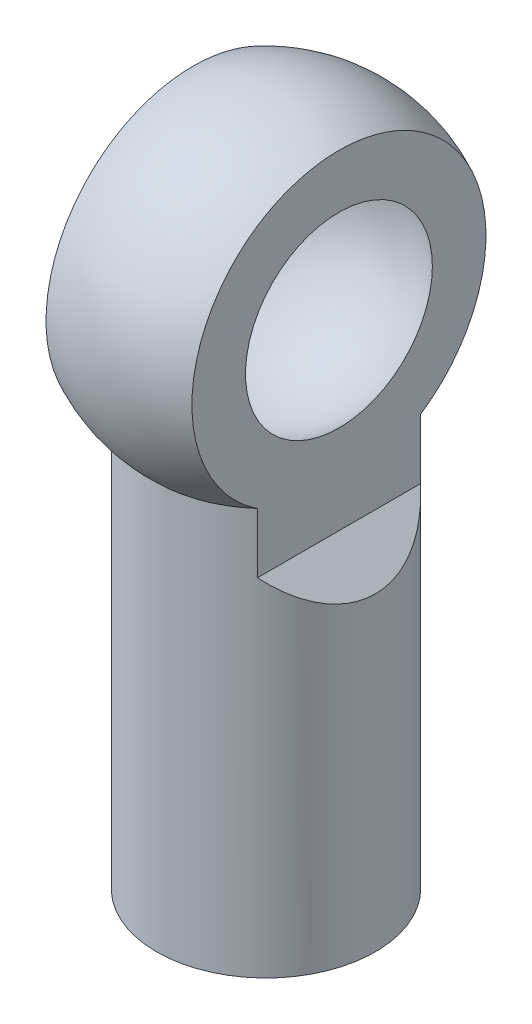
ISO-10303-21;
HEADER;
FILE_DESCRIPTION(('STEP AP214'),'2;1');
FILE_NAME('part.step','',(''),(''),'','','');
FILE_SCHEMA(('AUTOMOTIVE_DESIGN { 1 0 10303 214 1 1 1 1 }'));
ENDSEC;
DATA;
#1=APPLICATION_CONTEXT('core data for automotive mechanical design processes');
#2=APPLICATION_PROTOCOL_DEFINITION('international standard','automotive_design',2000,#1);
#3=PRODUCT_CONTEXT('',#1,'mechanical');
#4=PRODUCT('Part','Part','',(#3));
#5=PRODUCT_RELATED_PRODUCT_CATEGORY('part','',(#4));
#6=PRODUCT_DEFINITION_FORMATION('','',#4);
#7=PRODUCT_DEFINITION_CONTEXT('part definition',#1,'design');
#8=PRODUCT_DEFINITION('design','',#6,#7);
#9=PRODUCT_DEFINITION_SHAPE('','',#8);
#10=(LENGTH_UNIT() NAMED_UNIT(*) SI_UNIT(.MILLI.,.METRE.));
#11=(NAMED_UNIT(*) PLANE_ANGLE_UNIT() SI_UNIT($,.RADIAN.));
#12=(NAMED_UNIT(*) SI_UNIT($,.STERADIAN.) SOLID_ANGLE_UNIT());
#13=UNCERTAINTY_MEASURE_WITH_UNIT(LENGTH_MEASURE(1.E-05),#10,'distance_accuracy_value','');
#14=(GEOMETRIC_REPRESENTATION_CONTEXT(3) GLOBAL_UNCERTAINTY_ASSIGNED_CONTEXT((#13)) GLOBAL_UNIT_ASSIGNED_CONTEXT((#10,
#11,#12)) REPRESENTATION_CONTEXT('',''));
#15=CARTESIAN_POINT('',(0.,0.,0.));
#16=DIRECTION('',(0.,0.,1.));
#17=DIRECTION('',(1.,0.,0.));
#18=AXIS2_PLACEMENT_3D('',#15,#16,#17);
#19=CARTESIAN_POINT('',(0.,11.5,0.));
#20=DIRECTION('',(0.,-1.,0.));
#21=DIRECTION('',(0.,0.,-1.));
#22=AXIS2_PLACEMENT_3D('',#19,#20,#21);
#23=CYLINDRICAL_SURFACE('',#22,3.);
#24=CARTESIAN_POINT('',(0.,0.,0.));
#25=DIRECTION('',(0.,1.,0.));
#26=DIRECTION('',(0.,0.,1.));
#27=AXIS2_PLACEMENT_3D('',#24,#25,#26);
#28=CIRCLE('',#27,3.);
#29=CARTESIAN_POINT('',(0.,0.,3.));
#30=VERTEX_POINT('',#29);
#31=EDGE_CURVE('E121',#30,#30,#28,.T.);
#32=ORIENTED_EDGE('',*,*,#31,.T.);
#33=EDGE_LOOP('',(#32));
#34=FACE_BOUND('',#33,.T.);
#35=DIRECTION('',(0.,-1.,0.));
#36=VECTOR('',#35,1.);
#37=CARTESIAN_POINT('',(-2.,11.5,2.23606797749979));
#38=LINE('',#37,#36);
#39=CARTESIAN_POINT('',(-2.,11.1458980337503,2.23606797749979));
#40=VERTEX_POINT('',#39);
#41=CARTESIAN_POINT('',(-2.,9.5,2.23606797749979));
#42=VERTEX_POINT('',#41);
#43=EDGE_CURVE('E97',#40,#42,#38,.T.);
#44=ORIENTED_EDGE('',*,*,#43,.T.);
#45=CARTESIAN_POINT('',(0.,11.5,0.));
#46=DIRECTION('',(0.707106781186548,-0.707106781186547,0.));
#47=DIRECTION('',(-0.707106781186547,-0.707106781186548,0.));
#48=AXIS2_PLACEMENT_3D('',#45,#46,#47);
#49=ELLIPSE('',#48,4.24264068711929,3.);
#50=CARTESIAN_POINT('',(-2.,9.5,-2.23606797749979));
#51=VERTEX_POINT('',#50);
#52=EDGE_CURVE('E90',#42,#51,#49,.T.);
#53=ORIENTED_EDGE('',*,*,#52,.T.);
#54=DIRECTION('',(0.,-1.,0.));
#55=VECTOR('',#54,1.);
#56=CARTESIAN_POINT('',(-2.,11.5,-2.23606797749979));
#57=LINE('',#56,#55);
#58=CARTESIAN_POINT('',(-2.,11.1458980337503,-2.23606797749979));
#59=VERTEX_POINT('',#58);
#60=EDGE_CURVE('E95',#51,#59,#57,.F.);
#61=ORIENTED_EDGE('',*,*,#60,.T.);
#62=CARTESIAN_POINT('',(0.,11.1458980337503,0.));
#63=DIRECTION('',(0.,1.,0.));
#64=DIRECTION('',(0.,0.,1.));
#65=AXIS2_PLACEMENT_3D('',#62,#63,#64);
#66=CIRCLE('',#65,3.);
#67=CARTESIAN_POINT('',(2.,11.1458980337503,-2.23606797749979));
#68=VERTEX_POINT('',#67);
#69=EDGE_CURVE('E11',#68,#59,#66,.T.);
#70=ORIENTED_EDGE('',*,*,#69,.F.);
#71=DIRECTION('',(0.,-1.,0.));
#72=VECTOR('',#71,1.);
#73=CARTESIAN_POINT('',(2.,11.5,-2.23606797749979));
#74=LINE('',#73,#72);
#75=CARTESIAN_POINT('',(2.,9.5,-2.23606797749979));
#76=VERTEX_POINT('',#75);
#77=EDGE_CURVE('E109',#76,#68,#74,.F.);
#78=ORIENTED_EDGE('',*,*,#77,.F.);
#79=CARTESIAN_POINT('',(0.,11.5,0.));
#80=DIRECTION('',(0.707106781186547,0.707106781186548,0.));
#81=DIRECTION('',(0.707106781186548,-0.707106781186547,0.));
#82=AXIS2_PLACEMENT_3D('',#79,#80,#81);
#83=ELLIPSE('',#82,4.24264068711928,3.);
#84=CARTESIAN_POINT('',(2.,9.5,2.23606797749979));
#85=VERTEX_POINT('',#84);
#86=EDGE_CURVE('E68',#85,#76,#83,.T.);
#87=ORIENTED_EDGE('',*,*,#86,.F.);
#88=DIRECTION('',(0.,-1.,0.));
#89=VECTOR('',#88,1.);
#90=CARTESIAN_POINT('',(2.,11.5,2.23606797749979));
#91=LINE('',#90,#89);
#92=CARTESIAN_POINT('',(2.,11.1458980337503,2.23606797749979));
#93=VERTEX_POINT('',#92);
#94=EDGE_CURVE('E114',#93,#85,#91,.T.);
#95=ORIENTED_EDGE('',*,*,#94,.F.);
#96=EDGE_CURVE('E53',#40,#93,#66,.T.);
#97=ORIENTED_EDGE('',*,*,#96,.F.);
#98=EDGE_LOOP('',(#44,#53,#61,#70,#78,#87,#95,#97));
#99=FACE_BOUND('',#98,.T.);
#100=ADVANCED_FACE('F45',(#34,#99),#23,.T.);
#101=CARTESIAN_POINT('',(0.,14.5,0.));
#102=DIRECTION('',(0.,1.,0.));
#103=DIRECTION('',(-1.,0.,0.));
#104=AXIS2_PLACEMENT_3D('',#101,#102,#103);
#105=SPHERICAL_SURFACE('',#104,4.5);
#106=ORIENTED_EDGE('',*,*,#69,.T.);
#107=CARTESIAN_POINT('',(-2.,14.5,0.));
#108=DIRECTION('',(1.,0.,0.));
#109=DIRECTION('',(0.,0.,-1.));
#110=AXIS2_PLACEMENT_3D('',#107,#108,#109);
#111=CIRCLE('',#110,4.03112887414927);
#112=EDGE_CURVE('E61',#59,#40,#111,.T.);
#113=ORIENTED_EDGE('',*,*,#112,.T.);
#114=ORIENTED_EDGE('',*,*,#96,.T.);
#115=CARTESIAN_POINT('',(2.,14.5,0.));
#116=DIRECTION('',(1.,0.,0.));
#117=DIRECTION('',(0.,0.,-1.));
#118=AXIS2_PLACEMENT_3D('',#115,#116,#117);
#119=CIRCLE('',#118,4.03112887414927);
#120=EDGE_CURVE('E111',#68,#93,#119,.T.);
#121=ORIENTED_EDGE('',*,*,#120,.F.);
#122=EDGE_LOOP('',(#106,#113,#114,#121));
#123=FACE_BOUND('',#122,.T.);
#124=ADVANCED_FACE('F139',(#123),#105,.T.);
#125=CARTESIAN_POINT('',(0.,11.5,0.));
#126=DIRECTION('',(0.,-1.,0.));
#127=DIRECTION('',(0.,0.,-1.));
#128=AXIS2_PLACEMENT_3D('',#125,#126,#127);
#129=CYLINDRICAL_SURFACE('',#128,1.5);
#130=CARTESIAN_POINT('',(0.,0.,0.));
#131=DIRECTION('',(0.,1.,0.));
#132=DIRECTION('',(0.,0.,1.));
#133=AXIS2_PLACEMENT_3D('',#130,#131,#132);
#134=CIRCLE('',#133,1.5);
#135=CARTESIAN_POINT('',(0.,0.,1.5));
#136=VERTEX_POINT('',#135);
#137=EDGE_CURVE('E118',#136,#136,#134,.T.);
#138=ORIENTED_EDGE('',*,*,#137,.F.);
#139=EDGE_LOOP('',(#138));
#140=FACE_BOUND('',#139,.T.);
#141=CARTESIAN_POINT('',(0.,10.2573593128807,0.));
#142=DIRECTION('',(0.,1.,0.));
#143=DIRECTION('',(0.,0.,1.));
#144=AXIS2_PLACEMENT_3D('',#141,#142,#143);
#145=CIRCLE('',#144,1.5);
#146=CARTESIAN_POINT('',(0.,10.2573593128807,1.5));
#147=VERTEX_POINT('',#146);
#148=EDGE_CURVE('E116',#147,#147,#145,.T.);
#149=ORIENTED_EDGE('',*,*,#148,.T.);
#150=EDGE_LOOP('',(#149));
#151=FACE_BOUND('',#150,.T.);
#152=ADVANCED_FACE('F141',(#140,#151),#129,.F.);
#153=CARTESIAN_POINT('',(0.,0.,0.));
#154=DIRECTION('',(0.,1.,0.));
#155=DIRECTION('',(0.,0.,1.));
#156=AXIS2_PLACEMENT_3D('',#153,#154,#155);
#157=PLANE('',#156);
#158=ORIENTED_EDGE('',*,*,#31,.F.);
#159=EDGE_LOOP('',(#158));
#160=FACE_BOUND('',#159,.T.);
#161=ORIENTED_EDGE('',*,*,#137,.T.);
#162=EDGE_LOOP('',(#161));
#163=FACE_BOUND('',#162,.T.);
#164=ADVANCED_FACE('F148',(#160,#163),#157,.F.);
#165=ORIENTED_EDGE('',*,*,#148,.F.);
#166=EDGE_LOOP('',(#165));
#167=FACE_BOUND('',#166,.T.);
#168=ADVANCED_FACE('F133',(#167),#105,.T.);
#169=CARTESIAN_POINT('',(2.,0.,0.));
#170=DIRECTION('',(1.,0.,0.));
#171=DIRECTION('',(0.,0.,-1.));
#172=AXIS2_PLACEMENT_3D('',#169,#170,#171);
#173=PLANE('',#172);
#174=CARTESIAN_POINT('',(2.,14.5,0.));
#175=DIRECTION('',(1.,0.,0.));
#176=DIRECTION('',(0.,0.,-1.));
#177=AXIS2_PLACEMENT_3D('',#174,#175,#176);
#178=CIRCLE('',#177,2.5617376914899);
#179=CARTESIAN_POINT('',(2.,14.5,-2.5617376914899));
#180=VERTEX_POINT('',#179);
#181=EDGE_CURVE('E108',#180,#180,#178,.T.);
#182=ORIENTED_EDGE('',*,*,#181,.F.);
#183=EDGE_LOOP('',(#182));
#184=FACE_BOUND('',#183,.T.);
#185=ORIENTED_EDGE('',*,*,#94,.T.);
#186=DIRECTION('',(0.,0.,-1.));
#187=VECTOR('',#186,1.);
#188=CARTESIAN_POINT('',(2.,9.5,4.5));
#189=LINE('',#188,#187);
#190=EDGE_CURVE('E106',#85,#76,#189,.T.);
#191=ORIENTED_EDGE('',*,*,#190,.T.);
#192=ORIENTED_EDGE('',*,*,#77,.T.);
#193=ORIENTED_EDGE('',*,*,#120,.T.);
#194=EDGE_LOOP('',(#185,#191,#192,#193));
#195=FACE_BOUND('',#194,.T.);
#196=ADVANCED_FACE('F130',(#184,#195),#173,.T.);
#197=CARTESIAN_POINT('',(0.,14.5,0.));
#198=DIRECTION('',(0.,1.,0.));
#199=DIRECTION('',(-1.,0.,0.));
#200=AXIS2_PLACEMENT_3D('',#197,#198,#199);
#201=SPHERICAL_SURFACE('',#200,3.25);
#202=CARTESIAN_POINT('',(0.,14.5,0.));
#203=DIRECTION('',(1.,0.,0.));
#204=DIRECTION('',(0.,0.,-1.));
#205=AXIS2_PLACEMENT_3D('',#202,#203,#204);
#206=SPHERICAL_SURFACE('',#205,3.25);
#207=CARTESIAN_POINT('',(-2.,14.5,0.));
#208=DIRECTION('',(1.,0.,0.));
#209=DIRECTION('',(0.,0.,-1.));
#210=AXIS2_PLACEMENT_3D('',#207,#208,#209);
#211=CIRCLE('',#210,2.5617376914899);
#212=CARTESIAN_POINT('',(-2.,14.5,-2.5617376914899));
#213=VERTEX_POINT('',#212);
#214=EDGE_CURVE('E48',#213,#213,#211,.T.);
#215=ORIENTED_EDGE('',*,*,#214,.F.);
#216=EDGE_LOOP('',(#215));
#217=FACE_BOUND('',#216,.T.);
#218=ORIENTED_EDGE('',*,*,#181,.T.);
#219=EDGE_LOOP('',(#218));
#220=FACE_BOUND('',#219,.T.);
#221=ADVANCED_FACE('F128',(#217,#220),#206,.F.);
#222=CARTESIAN_POINT('',(-2.,0.,0.));
#223=DIRECTION('',(1.,0.,0.));
#224=DIRECTION('',(0.,0.,-1.));
#225=AXIS2_PLACEMENT_3D('',#222,#223,#224);
#226=PLANE('',#225);
#227=ORIENTED_EDGE('',*,*,#214,.T.);
#228=EDGE_LOOP('',(#227));
#229=FACE_BOUND('',#228,.T.);
#230=ORIENTED_EDGE('',*,*,#112,.F.);
#231=ORIENTED_EDGE('',*,*,#60,.F.);
#232=DIRECTION('',(0.,0.,-1.));
#233=VECTOR('',#232,1.);
#234=CARTESIAN_POINT('',(-2.,9.5,4.5));
#235=LINE('',#234,#233);
#236=EDGE_CURVE('E87',#42,#51,#235,.T.);
#237=ORIENTED_EDGE('',*,*,#236,.F.);
#238=ORIENTED_EDGE('',*,*,#43,.F.);
#239=EDGE_LOOP('',(#230,#231,#237,#238));
#240=FACE_BOUND('',#239,.T.);
#241=ADVANCED_FACE('F99',(#229,#240),#226,.F.);
#242=CARTESIAN_POINT('',(5.75,5.75,0.));
#243=DIRECTION('',(0.707106781186547,0.707106781186548,0.));
#244=DIRECTION('',(-0.707106781186548,0.707106781186547,0.));
#245=AXIS2_PLACEMENT_3D('',#242,#243,#244);
#246=PLANE('',#245);
#247=ORIENTED_EDGE('',*,*,#86,.T.);
#248=ORIENTED_EDGE('',*,*,#190,.F.);
#249=EDGE_LOOP('',(#247,#248));
#250=FACE_BOUND('',#249,.T.);
#251=ADVANCED_FACE('F201',(#250),#246,.T.);
#252=CARTESIAN_POINT('',(-5.75,5.75,0.));
#253=DIRECTION('',(0.707106781186548,-0.707106781186547,0.));
#254=DIRECTION('',(0.707106781186547,0.707106781186548,0.));
#255=AXIS2_PLACEMENT_3D('',#252,#253,#254);
#256=PLANE('',#255);
#257=ORIENTED_EDGE('',*,*,#236,.T.);
#258=ORIENTED_EDGE('',*,*,#52,.F.);
#259=EDGE_LOOP('',(#257,#258));
#260=FACE_BOUND('',#259,.T.);
#261=ADVANCED_FACE('F89',(#260),#256,.F.);
#262=CLOSED_SHELL('',(#100,#124,#152,#164,#168,#196,#221,#241,#251,#261));
#263=MANIFOLD_SOLID_BREP('B2',#262);
#264=ADVANCED_BREP_SHAPE_REPRESENTATION('',(#18,#263),#14);
#265=SHAPE_DEFINITION_REPRESENTATION(#9,#264);
ENDSEC;
END-ISO-10303-21;
